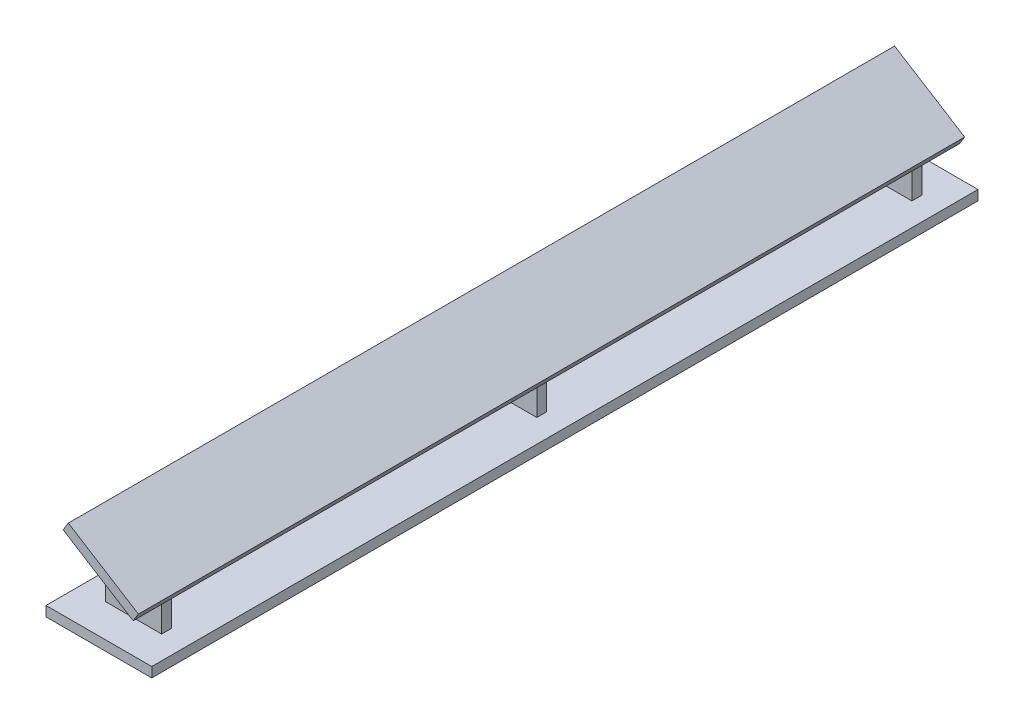
ISO-10303-21;
HEADER;
FILE_DESCRIPTION(('STEP AP214'),'2;1');
FILE_NAME('part.step','',(''),(''),'','','');
FILE_SCHEMA(('AUTOMOTIVE_DESIGN { 1 0 10303 214 1 1 1 1 }'));
ENDSEC;
DATA;
#1=APPLICATION_CONTEXT('core data for automotive mechanical design processes');
#2=APPLICATION_PROTOCOL_DEFINITION('international standard','automotive_design',2000,#1);
#3=PRODUCT_CONTEXT('',#1,'mechanical');
#4=PRODUCT('Part','Part','',(#3));
#5=PRODUCT_RELATED_PRODUCT_CATEGORY('part','',(#4));
#6=PRODUCT_DEFINITION_FORMATION('','',#4);
#7=PRODUCT_DEFINITION_CONTEXT('part definition',#1,'design');
#8=PRODUCT_DEFINITION('design','',#6,#7);
#9=PRODUCT_DEFINITION_SHAPE('','',#8);
#10=(LENGTH_UNIT() NAMED_UNIT(*) SI_UNIT(.MILLI.,.METRE.));
#11=(NAMED_UNIT(*) PLANE_ANGLE_UNIT() SI_UNIT($,.RADIAN.));
#12=(NAMED_UNIT(*) SI_UNIT($,.STERADIAN.) SOLID_ANGLE_UNIT());
#13=UNCERTAINTY_MEASURE_WITH_UNIT(LENGTH_MEASURE(1.E-05),#10,'distance_accuracy_value','');
#14=(GEOMETRIC_REPRESENTATION_CONTEXT(3) GLOBAL_UNCERTAINTY_ASSIGNED_CONTEXT((#13)) GLOBAL_UNIT_ASSIGNED_CONTEXT((#10,
#11,#12)) REPRESENTATION_CONTEXT('',''));
#15=CARTESIAN_POINT('',(0.,0.,0.));
#16=DIRECTION('',(0.,0.,1.));
#17=DIRECTION('',(1.,0.,0.));
#18=AXIS2_PLACEMENT_3D('',#15,#16,#17);
#19=CARTESIAN_POINT('',(940.,6.,500.));
#20=DIRECTION('',(1.,0.,0.));
#21=DIRECTION('',(0.,0.,-1.));
#22=AXIS2_PLACEMENT_3D('',#19,#20,#21);
#23=PLANE('',#22);
#24=DIRECTION('',(0.,-1.,0.));
#25=VECTOR('',#24,1.);
#26=CARTESIAN_POINT('',(940.,6.,0.));
#27=LINE('',#26,#25);
#28=CARTESIAN_POINT('',(940.,6.,0.));
#29=VERTEX_POINT('',#28);
#30=CARTESIAN_POINT('',(940.,0.,0.));
#31=VERTEX_POINT('',#30);
#32=EDGE_CURVE('E302',#29,#31,#27,.T.);
#33=ORIENTED_EDGE('',*,*,#32,.T.);
#34=DIRECTION('',(0.,0.,-1.));
#35=VECTOR('',#34,1.);
#36=CARTESIAN_POINT('',(940.,0.,500.));
#37=LINE('',#36,#35);
#38=CARTESIAN_POINT('',(940.,0.,500.));
#39=VERTEX_POINT('',#38);
#40=EDGE_CURVE('E11',#39,#31,#37,.T.);
#41=ORIENTED_EDGE('',*,*,#40,.F.);
#42=DIRECTION('',(0.,-1.,0.));
#43=VECTOR('',#42,1.);
#44=CARTESIAN_POINT('',(940.,6.,500.));
#45=LINE('',#44,#43);
#46=CARTESIAN_POINT('',(940.,6.,500.));
#47=VERTEX_POINT('',#46);
#48=EDGE_CURVE('E303',#47,#39,#45,.T.);
#49=ORIENTED_EDGE('',*,*,#48,.F.);
#50=DIRECTION('',(0.,0.,-1.));
#51=VECTOR('',#50,1.);
#52=CARTESIAN_POINT('',(940.,6.,500.));
#53=LINE('',#52,#51);
#54=EDGE_CURVE('E313',#47,#29,#53,.T.);
#55=ORIENTED_EDGE('',*,*,#54,.T.);
#56=EDGE_LOOP('',(#33,#41,#49,#55));
#57=FACE_BOUND('',#56,.T.);
#58=ADVANCED_FACE('F43',(#57),#23,.F.);
#59=CARTESIAN_POINT('',(940.,0.,500.));
#60=DIRECTION('',(0.,1.,0.));
#61=DIRECTION('',(0.,0.,1.));
#62=AXIS2_PLACEMENT_3D('',#59,#60,#61);
#63=PLANE('',#62);
#64=DIRECTION('',(1.,0.,0.));
#65=VECTOR('',#64,1.);
#66=CARTESIAN_POINT('',(940.,0.,0.));
#67=LINE('',#66,#65);
#68=CARTESIAN_POINT('',(1004.,0.,0.));
#69=VERTEX_POINT('',#68);
#70=EDGE_CURVE('E316',#31,#69,#67,.T.);
#71=ORIENTED_EDGE('',*,*,#70,.T.);
#72=DIRECTION('',(0.,0.,-1.));
#73=VECTOR('',#72,1.);
#74=CARTESIAN_POINT('',(1004.,0.,500.));
#75=LINE('',#74,#73);
#76=CARTESIAN_POINT('',(1004.,0.,500.));
#77=VERTEX_POINT('',#76);
#78=EDGE_CURVE('E50',#77,#69,#75,.T.);
#79=ORIENTED_EDGE('',*,*,#78,.F.);
#80=DIRECTION('',(1.,0.,0.));
#81=VECTOR('',#80,1.);
#82=CARTESIAN_POINT('',(940.,0.,500.));
#83=LINE('',#82,#81);
#84=EDGE_CURVE('E306',#39,#77,#83,.T.);
#85=ORIENTED_EDGE('',*,*,#84,.F.);
#86=ORIENTED_EDGE('',*,*,#40,.T.);
#87=EDGE_LOOP('',(#71,#79,#85,#86));
#88=FACE_BOUND('',#87,.T.);
#89=ADVANCED_FACE('F345',(#88),#63,.F.);
#90=CARTESIAN_POINT('',(1004.,0.,500.));
#91=DIRECTION('',(-1.,0.,0.));
#92=DIRECTION('',(0.,0.,1.));
#93=AXIS2_PLACEMENT_3D('',#90,#91,#92);
#94=PLANE('',#93);
#95=DIRECTION('',(0.,1.,0.));
#96=VECTOR('',#95,1.);
#97=CARTESIAN_POINT('',(1004.,0.,0.));
#98=LINE('',#97,#96);
#99=CARTESIAN_POINT('',(1004.,6.,0.));
#100=VERTEX_POINT('',#99);
#101=EDGE_CURVE('E318',#69,#100,#98,.T.);
#102=ORIENTED_EDGE('',*,*,#101,.T.);
#103=DIRECTION('',(0.,0.,-1.));
#104=VECTOR('',#103,1.);
#105=CARTESIAN_POINT('',(1004.,6.,500.));
#106=LINE('',#105,#104);
#107=CARTESIAN_POINT('',(1004.,6.,500.));
#108=VERTEX_POINT('',#107);
#109=EDGE_CURVE('E323',#108,#100,#106,.T.);
#110=ORIENTED_EDGE('',*,*,#109,.F.);
#111=DIRECTION('',(0.,1.,0.));
#112=VECTOR('',#111,1.);
#113=CARTESIAN_POINT('',(1004.,0.,500.));
#114=LINE('',#113,#112);
#115=EDGE_CURVE('E309',#77,#108,#114,.T.);
#116=ORIENTED_EDGE('',*,*,#115,.F.);
#117=ORIENTED_EDGE('',*,*,#78,.T.);
#118=EDGE_LOOP('',(#102,#110,#116,#117));
#119=FACE_BOUND('',#118,.T.);
#120=ADVANCED_FACE('F330',(#119),#94,.F.);
#121=CARTESIAN_POINT('',(1004.,6.,500.));
#122=DIRECTION('',(0.,-1.,0.));
#123=DIRECTION('',(0.,0.,-1.));
#124=AXIS2_PLACEMENT_3D('',#121,#122,#123);
#125=PLANE('',#124);
#126=DIRECTION('',(0.,0.,-1.));
#127=VECTOR('',#126,1.);
#128=CARTESIAN_POINT('',(990.,6.,480.));
#129=LINE('',#128,#127);
#130=CARTESIAN_POINT('',(990.,6.,480.));
#131=VERTEX_POINT('',#130);
#132=CARTESIAN_POINT('',(990.,6.,474.));
#133=VERTEX_POINT('',#132);
#134=EDGE_CURVE('E62',#131,#133,#129,.T.);
#135=ORIENTED_EDGE('',*,*,#134,.F.);
#136=DIRECTION('',(1.,0.,0.));
#137=VECTOR('',#136,1.);
#138=CARTESIAN_POINT('',(956.,6.,480.));
#139=LINE('',#138,#137);
#140=CARTESIAN_POINT('',(956.,6.,480.));
#141=VERTEX_POINT('',#140);
#142=EDGE_CURVE('E57',#141,#131,#139,.T.);
#143=ORIENTED_EDGE('',*,*,#142,.F.);
#144=DIRECTION('',(0.,0.,-1.));
#145=VECTOR('',#144,1.);
#146=CARTESIAN_POINT('',(956.,6.,480.));
#147=LINE('',#146,#145);
#148=CARTESIAN_POINT('',(956.,6.,474.));
#149=VERTEX_POINT('',#148);
#150=EDGE_CURVE('E175',#141,#149,#147,.T.);
#151=ORIENTED_EDGE('',*,*,#150,.T.);
#152=DIRECTION('',(1.,0.,0.));
#153=VECTOR('',#152,1.);
#154=CARTESIAN_POINT('',(956.,6.,474.));
#155=LINE('',#154,#153);
#156=EDGE_CURVE('E179',#149,#133,#155,.T.);
#157=ORIENTED_EDGE('',*,*,#156,.T.);
#158=EDGE_LOOP('',(#135,#143,#151,#157));
#159=FACE_BOUND('',#158,.T.);
#160=DIRECTION('',(0.,0.,-1.));
#161=VECTOR('',#160,1.);
#162=CARTESIAN_POINT('',(990.,6.,253.));
#163=LINE('',#162,#161);
#164=CARTESIAN_POINT('',(990.,6.,253.));
#165=VERTEX_POINT('',#164);
#166=CARTESIAN_POINT('',(990.,6.,247.));
#167=VERTEX_POINT('',#166);
#168=EDGE_CURVE('E236',#165,#167,#163,.T.);
#169=ORIENTED_EDGE('',*,*,#168,.F.);
#170=DIRECTION('',(1.,0.,0.));
#171=VECTOR('',#170,1.);
#172=CARTESIAN_POINT('',(956.,6.,253.));
#173=LINE('',#172,#171);
#174=CARTESIAN_POINT('',(956.,6.,253.));
#175=VERTEX_POINT('',#174);
#176=EDGE_CURVE('E213',#175,#165,#173,.T.);
#177=ORIENTED_EDGE('',*,*,#176,.F.);
#178=DIRECTION('',(0.,0.,-1.));
#179=VECTOR('',#178,1.);
#180=CARTESIAN_POINT('',(956.,6.,253.));
#181=LINE('',#180,#179);
#182=CARTESIAN_POINT('',(956.,6.,247.));
#183=VERTEX_POINT('',#182);
#184=EDGE_CURVE('E239',#175,#183,#181,.T.);
#185=ORIENTED_EDGE('',*,*,#184,.T.);
#186=DIRECTION('',(1.,0.,0.));
#187=VECTOR('',#186,1.);
#188=CARTESIAN_POINT('',(956.,6.,247.));
#189=LINE('',#188,#187);
#190=EDGE_CURVE('E226',#183,#167,#189,.T.);
#191=ORIENTED_EDGE('',*,*,#190,.T.);
#192=EDGE_LOOP('',(#169,#177,#185,#191));
#193=FACE_BOUND('',#192,.T.);
#194=DIRECTION('',(0.,0.,-1.));
#195=VECTOR('',#194,1.);
#196=CARTESIAN_POINT('',(990.,6.,26.));
#197=LINE('',#196,#195);
#198=CARTESIAN_POINT('',(990.,6.,26.));
#199=VERTEX_POINT('',#198);
#200=CARTESIAN_POINT('',(990.,6.,20.));
#201=VERTEX_POINT('',#200);
#202=EDGE_CURVE('E297',#199,#201,#197,.T.);
#203=ORIENTED_EDGE('',*,*,#202,.F.);
#204=DIRECTION('',(1.,0.,0.));
#205=VECTOR('',#204,1.);
#206=CARTESIAN_POINT('',(956.,6.,26.));
#207=LINE('',#206,#205);
#208=CARTESIAN_POINT('',(956.,6.,26.));
#209=VERTEX_POINT('',#208);
#210=EDGE_CURVE('E275',#209,#199,#207,.T.);
#211=ORIENTED_EDGE('',*,*,#210,.F.);
#212=DIRECTION('',(0.,0.,-1.));
#213=VECTOR('',#212,1.);
#214=CARTESIAN_POINT('',(956.,6.,26.));
#215=LINE('',#214,#213);
#216=CARTESIAN_POINT('',(956.,6.,20.));
#217=VERTEX_POINT('',#216);
#218=EDGE_CURVE('E300',#209,#217,#215,.T.);
#219=ORIENTED_EDGE('',*,*,#218,.T.);
#220=DIRECTION('',(1.,0.,0.));
#221=VECTOR('',#220,1.);
#222=CARTESIAN_POINT('',(956.,6.,20.));
#223=LINE('',#222,#221);
#224=EDGE_CURVE('E286',#217,#201,#223,.T.);
#225=ORIENTED_EDGE('',*,*,#224,.T.);
#226=EDGE_LOOP('',(#203,#211,#219,#225));
#227=FACE_BOUND('',#226,.T.);
#228=DIRECTION('',(-1.,0.,0.));
#229=VECTOR('',#228,1.);
#230=CARTESIAN_POINT('',(1004.,6.,0.));
#231=LINE('',#230,#229);
#232=EDGE_CURVE('E307',#100,#29,#231,.T.);
#233=ORIENTED_EDGE('',*,*,#232,.T.);
#234=ORIENTED_EDGE('',*,*,#54,.F.);
#235=DIRECTION('',(-1.,0.,0.));
#236=VECTOR('',#235,1.);
#237=CARTESIAN_POINT('',(1004.,6.,500.));
#238=LINE('',#237,#236);
#239=EDGE_CURVE('E311',#108,#47,#238,.T.);
#240=ORIENTED_EDGE('',*,*,#239,.F.);
#241=ORIENTED_EDGE('',*,*,#109,.T.);
#242=EDGE_LOOP('',(#233,#234,#240,#241));
#243=FACE_BOUND('',#242,.T.);
#244=ADVANCED_FACE('F177',(#159,#193,#227,#243),#125,.F.);
#245=CARTESIAN_POINT('',(0.,0.,500.));
#246=DIRECTION('',(0.,0.,1.));
#247=DIRECTION('',(1.,0.,0.));
#248=AXIS2_PLACEMENT_3D('',#245,#246,#247);
#249=PLANE('',#248);
#250=ORIENTED_EDGE('',*,*,#48,.T.);
#251=ORIENTED_EDGE('',*,*,#84,.T.);
#252=ORIENTED_EDGE('',*,*,#115,.T.);
#253=ORIENTED_EDGE('',*,*,#239,.T.);
#254=EDGE_LOOP('',(#250,#251,#252,#253));
#255=FACE_BOUND('',#254,.T.);
#256=ADVANCED_FACE('F344',(#255),#249,.T.);
#257=CARTESIAN_POINT('',(0.,0.,0.));
#258=DIRECTION('',(0.,0.,1.));
#259=DIRECTION('',(1.,0.,0.));
#260=AXIS2_PLACEMENT_3D('',#257,#258,#259);
#261=PLANE('',#260);
#262=ORIENTED_EDGE('',*,*,#32,.F.);
#263=ORIENTED_EDGE('',*,*,#232,.F.);
#264=ORIENTED_EDGE('',*,*,#101,.F.);
#265=ORIENTED_EDGE('',*,*,#70,.F.);
#266=EDGE_LOOP('',(#262,#263,#264,#265));
#267=FACE_BOUND('',#266,.T.);
#268=ADVANCED_FACE('F336',(#267),#261,.F.);
#269=CARTESIAN_POINT('',(956.,47.3156464261822,26.));
#270=DIRECTION('',(1.,0.,0.));
#271=DIRECTION('',(0.,0.,-1.));
#272=AXIS2_PLACEMENT_3D('',#269,#270,#271);
#273=PLANE('',#272);
#274=DIRECTION('',(0.,-1.,0.));
#275=VECTOR('',#274,1.);
#276=CARTESIAN_POINT('',(956.,47.3156464261822,20.));
#277=LINE('',#276,#275);
#278=CARTESIAN_POINT('',(956.,47.3156464261821,20.));
#279=VERTEX_POINT('',#278);
#280=EDGE_CURVE('E271',#279,#217,#277,.T.);
#281=ORIENTED_EDGE('',*,*,#280,.T.);
#282=ORIENTED_EDGE('',*,*,#218,.F.);
#283=DIRECTION('',(0.,-1.,0.));
#284=VECTOR('',#283,1.);
#285=CARTESIAN_POINT('',(956.,47.3156464261822,26.));
#286=LINE('',#285,#284);
#287=CARTESIAN_POINT('',(956.,47.3156464261822,26.));
#288=VERTEX_POINT('',#287);
#289=EDGE_CURVE('E272',#288,#209,#286,.T.);
#290=ORIENTED_EDGE('',*,*,#289,.F.);
#291=DIRECTION('',(0.,0.,-1.));
#292=VECTOR('',#291,1.);
#293=CARTESIAN_POINT('',(956.,47.3156464261822,26.));
#294=LINE('',#293,#292);
#295=EDGE_CURVE('E283',#288,#279,#294,.T.);
#296=ORIENTED_EDGE('',*,*,#295,.T.);
#297=EDGE_LOOP('',(#281,#282,#290,#296));
#298=FACE_BOUND('',#297,.T.);
#299=ADVANCED_FACE('F357',(#298),#273,.F.);
#300=CARTESIAN_POINT('',(990.,6.,26.));
#301=DIRECTION('',(-1.,0.,0.));
#302=DIRECTION('',(0.,0.,1.));
#303=AXIS2_PLACEMENT_3D('',#300,#301,#302);
#304=PLANE('',#303);
#305=DIRECTION('',(0.,1.,0.));
#306=VECTOR('',#305,1.);
#307=CARTESIAN_POINT('',(990.,6.,20.));
#308=LINE('',#307,#306);
#309=CARTESIAN_POINT('',(990.,26.0700884612651,20.));
#310=VERTEX_POINT('',#309);
#311=EDGE_CURVE('E288',#201,#310,#308,.T.);
#312=ORIENTED_EDGE('',*,*,#311,.T.);
#313=DIRECTION('',(0.,0.,-1.));
#314=VECTOR('',#313,1.);
#315=CARTESIAN_POINT('',(990.,26.0700884612651,26.));
#316=LINE('',#315,#314);
#317=CARTESIAN_POINT('',(990.,26.0700884612651,26.));
#318=VERTEX_POINT('',#317);
#319=EDGE_CURVE('E294',#318,#310,#316,.T.);
#320=ORIENTED_EDGE('',*,*,#319,.F.);
#321=DIRECTION('',(0.,1.,0.));
#322=VECTOR('',#321,1.);
#323=CARTESIAN_POINT('',(990.,6.,26.));
#324=LINE('',#323,#322);
#325=EDGE_CURVE('E279',#199,#318,#324,.T.);
#326=ORIENTED_EDGE('',*,*,#325,.F.);
#327=ORIENTED_EDGE('',*,*,#202,.T.);
#328=EDGE_LOOP('',(#312,#320,#326,#327));
#329=FACE_BOUND('',#328,.T.);
#330=ADVANCED_FACE('F362',(#329),#304,.F.);
#331=CARTESIAN_POINT('',(0.,0.,26.));
#332=DIRECTION('',(0.,0.,1.));
#333=DIRECTION('',(1.,0.,0.));
#334=AXIS2_PLACEMENT_3D('',#331,#332,#333);
#335=PLANE('',#334);
#336=ORIENTED_EDGE('',*,*,#289,.T.);
#337=ORIENTED_EDGE('',*,*,#210,.T.);
#338=ORIENTED_EDGE('',*,*,#325,.T.);
#339=DIRECTION('',(-0.848048096156427,0.529919264233204,0.));
#340=VECTOR('',#339,1.);
#341=CARTESIAN_POINT('',(990.,26.0700884612651,26.));
#342=LINE('',#341,#340);
#343=EDGE_CURVE('E281',#318,#288,#342,.T.);
#344=ORIENTED_EDGE('',*,*,#343,.T.);
#345=EDGE_LOOP('',(#336,#337,#338,#344));
#346=FACE_BOUND('',#345,.T.);
#347=ADVANCED_FACE('F366',(#346),#335,.T.);
#348=CARTESIAN_POINT('',(0.,0.,20.));
#349=DIRECTION('',(0.,0.,1.));
#350=DIRECTION('',(1.,0.,0.));
#351=AXIS2_PLACEMENT_3D('',#348,#349,#350);
#352=PLANE('',#351);
#353=ORIENTED_EDGE('',*,*,#280,.F.);
#354=DIRECTION('',(-0.848048096156427,0.529919264233204,0.));
#355=VECTOR('',#354,1.);
#356=CARTESIAN_POINT('',(990.,26.0700884612651,20.));
#357=LINE('',#356,#355);
#358=EDGE_CURVE('E276',#310,#279,#357,.T.);
#359=ORIENTED_EDGE('',*,*,#358,.F.);
#360=ORIENTED_EDGE('',*,*,#311,.F.);
#361=ORIENTED_EDGE('',*,*,#224,.F.);
#362=EDGE_LOOP('',(#353,#359,#360,#361));
#363=FACE_BOUND('',#362,.T.);
#364=ADVANCED_FACE('F368',(#363),#352,.F.);
#365=CARTESIAN_POINT('',(950.346498706273,50.8483461156122,500.));
#366=DIRECTION('',(0.84804809615642,-0.529919264233214,0.));
#367=DIRECTION('',(0.529919264233214,0.84804809615642,0.));
#368=AXIS2_PLACEMENT_3D('',#365,#366,#367);
#369=PLANE('',#368);
#370=DIRECTION('',(-0.529919264233214,-0.84804809615642,0.));
#371=VECTOR('',#370,1.);
#372=CARTESIAN_POINT('',(950.346498706273,50.8483461156122,0.));
#373=LINE('',#372,#371);
#374=CARTESIAN_POINT('',(953.526014291672,55.9366346925507,0.));
#375=VERTEX_POINT('',#374);
#376=CARTESIAN_POINT('',(950.346498706273,50.8483461156122,0.));
#377=VERTEX_POINT('',#376);
#378=EDGE_CURVE('E241',#375,#377,#373,.T.);
#379=ORIENTED_EDGE('',*,*,#378,.T.);
#380=DIRECTION('',(0.,0.,-1.));
#381=VECTOR('',#380,1.);
#382=CARTESIAN_POINT('',(950.346498706273,50.8483461156122,500.));
#383=LINE('',#382,#381);
#384=CARTESIAN_POINT('',(950.346498706273,50.8483461156122,500.));
#385=VERTEX_POINT('',#384);
#386=EDGE_CURVE('E268',#385,#377,#383,.T.);
#387=ORIENTED_EDGE('',*,*,#386,.F.);
#388=DIRECTION('',(-0.529919264233214,-0.84804809615642,0.));
#389=VECTOR('',#388,1.);
#390=CARTESIAN_POINT('',(950.346498706273,50.8483461156122,500.));
#391=LINE('',#390,#389);
#392=CARTESIAN_POINT('',(953.526014291672,55.9366346925507,500.));
#393=VERTEX_POINT('',#392);
#394=EDGE_CURVE('E242',#393,#385,#391,.T.);
#395=ORIENTED_EDGE('',*,*,#394,.F.);
#396=DIRECTION('',(0.,0.,-1.));
#397=VECTOR('',#396,1.);
#398=CARTESIAN_POINT('',(953.526014291672,55.9366346925507,500.));
#399=LINE('',#398,#397);
#400=EDGE_CURVE('E252',#393,#375,#399,.T.);
#401=ORIENTED_EDGE('',*,*,#400,.T.);
#402=EDGE_LOOP('',(#379,#387,#395,#401));
#403=FACE_BOUND('',#402,.T.);
#404=ADVANCED_FACE('F371',(#403),#369,.F.);
#405=CARTESIAN_POINT('',(992.748903514094,24.3523829039519,500.));
#406=DIRECTION('',(0.529919264233206,0.848048096156426,0.));
#407=DIRECTION('',(-0.848048096156425,0.529919264233206,0.));
#408=AXIS2_PLACEMENT_3D('',#405,#406,#407);
#409=PLANE('',#408);
#410=DIRECTION('',(0.,0.,-1.));
#411=VECTOR('',#410,1.);
#412=CARTESIAN_POINT('',(956.,47.3156464261822,480.));
#413=LINE('',#412,#411);
#414=CARTESIAN_POINT('',(956.,47.3156464261822,480.));
#415=VERTEX_POINT('',#414);
#416=CARTESIAN_POINT('',(956.,47.3156464261822,474.));
#417=VERTEX_POINT('',#416);
#418=EDGE_CURVE('E196',#415,#417,#413,.T.);
#419=ORIENTED_EDGE('',*,*,#418,.F.);
#420=DIRECTION('',(-0.848048096156427,0.529919264233204,0.));
#421=VECTOR('',#420,1.);
#422=CARTESIAN_POINT('',(990.,26.0700884612651,480.));
#423=LINE('',#422,#421);
#424=CARTESIAN_POINT('',(990.,26.070088461265,480.));
#425=VERTEX_POINT('',#424);
#426=EDGE_CURVE('E199',#425,#415,#423,.T.);
#427=ORIENTED_EDGE('',*,*,#426,.F.);
#428=DIRECTION('',(0.,0.,-1.));
#429=VECTOR('',#428,1.);
#430=CARTESIAN_POINT('',(990.,26.0700884612651,480.));
#431=LINE('',#430,#429);
#432=CARTESIAN_POINT('',(990.,26.0700884612651,474.));
#433=VERTEX_POINT('',#432);
#434=EDGE_CURVE('E207',#425,#433,#431,.T.);
#435=ORIENTED_EDGE('',*,*,#434,.T.);
#436=DIRECTION('',(-0.848048096156427,0.529919264233204,0.));
#437=VECTOR('',#436,1.);
#438=CARTESIAN_POINT('',(990.,26.0700884612651,474.));
#439=LINE('',#438,#437);
#440=EDGE_CURVE('E203',#433,#417,#439,.T.);
#441=ORIENTED_EDGE('',*,*,#440,.T.);
#442=EDGE_LOOP('',(#419,#427,#435,#441));
#443=FACE_BOUND('',#442,.T.);
#444=DIRECTION('',(0.,0.,-1.));
#445=VECTOR('',#444,1.);
#446=CARTESIAN_POINT('',(956.,47.3156464261822,253.));
#447=LINE('',#446,#445);
#448=CARTESIAN_POINT('',(956.,47.3156464261822,253.));
#449=VERTEX_POINT('',#448);
#450=CARTESIAN_POINT('',(956.,47.3156464261822,247.));
#451=VERTEX_POINT('',#450);
#452=EDGE_CURVE('E223',#449,#451,#447,.T.);
#453=ORIENTED_EDGE('',*,*,#452,.F.);
#454=DIRECTION('',(-0.848048096156427,0.529919264233204,0.));
#455=VECTOR('',#454,1.);
#456=CARTESIAN_POINT('',(990.,26.0700884612651,253.));
#457=LINE('',#456,#455);
#458=CARTESIAN_POINT('',(990.,26.070088461265,253.));
#459=VERTEX_POINT('',#458);
#460=EDGE_CURVE('E220',#459,#449,#457,.T.);
#461=ORIENTED_EDGE('',*,*,#460,.F.);
#462=DIRECTION('',(0.,0.,-1.));
#463=VECTOR('',#462,1.);
#464=CARTESIAN_POINT('',(990.,26.0700884612651,253.));
#465=LINE('',#464,#463);
#466=CARTESIAN_POINT('',(990.,26.0700884612651,247.));
#467=VERTEX_POINT('',#466);
#468=EDGE_CURVE('E234',#459,#467,#465,.T.);
#469=ORIENTED_EDGE('',*,*,#468,.T.);
#470=DIRECTION('',(-0.848048096156427,0.529919264233204,0.));
#471=VECTOR('',#470,1.);
#472=CARTESIAN_POINT('',(990.,26.0700884612651,247.));
#473=LINE('',#472,#471);
#474=EDGE_CURVE('E214',#467,#451,#473,.T.);
#475=ORIENTED_EDGE('',*,*,#474,.T.);
#476=EDGE_LOOP('',(#453,#461,#469,#475));
#477=FACE_BOUND('',#476,.T.);
#478=ORIENTED_EDGE('',*,*,#343,.F.);
#479=ORIENTED_EDGE('',*,*,#319,.T.);
#480=ORIENTED_EDGE('',*,*,#358,.T.);
#481=ORIENTED_EDGE('',*,*,#295,.F.);
#482=EDGE_LOOP('',(#478,#479,#480,#481));
#483=FACE_BOUND('',#482,.T.);
#484=DIRECTION('',(0.848048096156425,-0.529919264233206,0.));
#485=VECTOR('',#484,1.);
#486=CARTESIAN_POINT('',(992.748903514094,24.3523829039519,0.));
#487=LINE('',#486,#485);
#488=CARTESIAN_POINT('',(992.748903514094,24.3523829039519,0.));
#489=VERTEX_POINT('',#488);
#490=EDGE_CURVE('E255',#377,#489,#487,.T.);
#491=ORIENTED_EDGE('',*,*,#490,.T.);
#492=DIRECTION('',(0.,0.,-1.));
#493=VECTOR('',#492,1.);
#494=CARTESIAN_POINT('',(992.748903514094,24.3523829039519,500.));
#495=LINE('',#494,#493);
#496=CARTESIAN_POINT('',(992.748903514094,24.3523829039519,500.));
#497=VERTEX_POINT('',#496);
#498=EDGE_CURVE('E265',#497,#489,#495,.T.);
#499=ORIENTED_EDGE('',*,*,#498,.F.);
#500=DIRECTION('',(0.848048096156425,-0.529919264233206,0.));
#501=VECTOR('',#500,1.);
#502=CARTESIAN_POINT('',(992.748903514094,24.3523829039519,500.));
#503=LINE('',#502,#501);
#504=EDGE_CURVE('E245',#385,#497,#503,.T.);
#505=ORIENTED_EDGE('',*,*,#504,.F.);
#506=ORIENTED_EDGE('',*,*,#386,.T.);
#507=EDGE_LOOP('',(#491,#499,#505,#506));
#508=FACE_BOUND('',#507,.T.);
#509=ADVANCED_FACE('F378',(#443,#477,#483,#508),#409,.F.);
#510=CARTESIAN_POINT('',(995.928419099493,29.4406714808905,500.));
#511=DIRECTION('',(-0.84804809615642,0.529919264233214,0.));
#512=DIRECTION('',(-0.529919264233214,-0.84804809615642,0.));
#513=AXIS2_PLACEMENT_3D('',#510,#511,#512);
#514=PLANE('',#513);
#515=DIRECTION('',(0.529919264233214,0.84804809615642,0.));
#516=VECTOR('',#515,1.);
#517=CARTESIAN_POINT('',(995.928419099493,29.4406714808905,0.));
#518=LINE('',#517,#516);
#519=CARTESIAN_POINT('',(995.928419099493,29.4406714808905,0.));
#520=VERTEX_POINT('',#519);
#521=EDGE_CURVE('E257',#489,#520,#518,.T.);
#522=ORIENTED_EDGE('',*,*,#521,.T.);
#523=DIRECTION('',(0.,0.,-1.));
#524=VECTOR('',#523,1.);
#525=CARTESIAN_POINT('',(995.928419099493,29.4406714808905,500.));
#526=LINE('',#525,#524);
#527=CARTESIAN_POINT('',(995.928419099493,29.4406714808905,500.));
#528=VERTEX_POINT('',#527);
#529=EDGE_CURVE('E262',#528,#520,#526,.T.);
#530=ORIENTED_EDGE('',*,*,#529,.F.);
#531=DIRECTION('',(0.529919264233214,0.84804809615642,0.));
#532=VECTOR('',#531,1.);
#533=CARTESIAN_POINT('',(995.928419099493,29.4406714808905,500.));
#534=LINE('',#533,#532);
#535=EDGE_CURVE('E248',#497,#528,#534,.T.);
#536=ORIENTED_EDGE('',*,*,#535,.F.);
#537=ORIENTED_EDGE('',*,*,#498,.T.);
#538=EDGE_LOOP('',(#522,#530,#536,#537));
#539=FACE_BOUND('',#538,.T.);
#540=ADVANCED_FACE('F382',(#539),#514,.F.);
#541=CARTESIAN_POINT('',(953.526014291672,55.9366346925507,500.));
#542=DIRECTION('',(-0.529919264233206,-0.848048096156426,0.));
#543=DIRECTION('',(0.848048096156425,-0.529919264233206,0.));
#544=AXIS2_PLACEMENT_3D('',#541,#542,#543);
#545=PLANE('',#544);
#546=DIRECTION('',(-0.848048096156425,0.529919264233206,0.));
#547=VECTOR('',#546,1.);
#548=CARTESIAN_POINT('',(953.526014291672,55.9366346925507,0.));
#549=LINE('',#548,#547);
#550=EDGE_CURVE('E246',#520,#375,#549,.T.);
#551=ORIENTED_EDGE('',*,*,#550,.T.);
#552=ORIENTED_EDGE('',*,*,#400,.F.);
#553=DIRECTION('',(-0.848048096156425,0.529919264233206,0.));
#554=VECTOR('',#553,1.);
#555=CARTESIAN_POINT('',(953.526014291672,55.9366346925507,500.));
#556=LINE('',#555,#554);
#557=EDGE_CURVE('E250',#528,#393,#556,.T.);
#558=ORIENTED_EDGE('',*,*,#557,.F.);
#559=ORIENTED_EDGE('',*,*,#529,.T.);
#560=EDGE_LOOP('',(#551,#552,#558,#559));
#561=FACE_BOUND('',#560,.T.);
#562=ADVANCED_FACE('F386',(#561),#545,.F.);
#563=CARTESIAN_POINT('',(0.,0.,500.));
#564=DIRECTION('',(0.,0.,-1.));
#565=DIRECTION('',(-1.,0.,0.));
#566=AXIS2_PLACEMENT_3D('',#563,#564,#565);
#567=PLANE('',#566);
#568=ORIENTED_EDGE('',*,*,#394,.T.);
#569=ORIENTED_EDGE('',*,*,#504,.T.);
#570=ORIENTED_EDGE('',*,*,#535,.T.);
#571=ORIENTED_EDGE('',*,*,#557,.T.);
#572=EDGE_LOOP('',(#568,#569,#570,#571));
#573=FACE_BOUND('',#572,.T.);
#574=ADVANCED_FACE('F390',(#573),#567,.F.);
#575=CARTESIAN_POINT('',(0.,0.,0.));
#576=DIRECTION('',(0.,0.,-1.));
#577=DIRECTION('',(-1.,0.,0.));
#578=AXIS2_PLACEMENT_3D('',#575,#576,#577);
#579=PLANE('',#578);
#580=ORIENTED_EDGE('',*,*,#378,.F.);
#581=ORIENTED_EDGE('',*,*,#550,.F.);
#582=ORIENTED_EDGE('',*,*,#521,.F.);
#583=ORIENTED_EDGE('',*,*,#490,.F.);
#584=EDGE_LOOP('',(#580,#581,#582,#583));
#585=FACE_BOUND('',#584,.T.);
#586=ADVANCED_FACE('F392',(#585),#579,.T.);
#587=CARTESIAN_POINT('',(956.,47.3156464261822,253.));
#588=DIRECTION('',(1.,0.,0.));
#589=DIRECTION('',(0.,0.,-1.));
#590=AXIS2_PLACEMENT_3D('',#587,#588,#589);
#591=PLANE('',#590);
#592=DIRECTION('',(0.,-1.,0.));
#593=VECTOR('',#592,1.);
#594=CARTESIAN_POINT('',(956.,47.3156464261822,247.));
#595=LINE('',#594,#593);
#596=EDGE_CURVE('E183',#451,#183,#595,.T.);
#597=ORIENTED_EDGE('',*,*,#596,.T.);
#598=ORIENTED_EDGE('',*,*,#184,.F.);
#599=DIRECTION('',(0.,-1.,0.));
#600=VECTOR('',#599,1.);
#601=CARTESIAN_POINT('',(956.,47.3156464261822,253.));
#602=LINE('',#601,#600);
#603=EDGE_CURVE('E210',#449,#175,#602,.T.);
#604=ORIENTED_EDGE('',*,*,#603,.F.);
#605=ORIENTED_EDGE('',*,*,#452,.T.);
#606=EDGE_LOOP('',(#597,#598,#604,#605));
#607=FACE_BOUND('',#606,.T.);
#608=ADVANCED_FACE('F395',(#607),#591,.F.);
#609=CARTESIAN_POINT('',(990.,6.,253.));
#610=DIRECTION('',(-1.,0.,0.));
#611=DIRECTION('',(0.,0.,1.));
#612=AXIS2_PLACEMENT_3D('',#609,#610,#611);
#613=PLANE('',#612);
#614=DIRECTION('',(0.,1.,0.));
#615=VECTOR('',#614,1.);
#616=CARTESIAN_POINT('',(990.,6.,247.));
#617=LINE('',#616,#615);
#618=EDGE_CURVE('E228',#167,#467,#617,.T.);
#619=ORIENTED_EDGE('',*,*,#618,.T.);
#620=ORIENTED_EDGE('',*,*,#468,.F.);
#621=DIRECTION('',(0.,1.,0.));
#622=VECTOR('',#621,1.);
#623=CARTESIAN_POINT('',(990.,6.,253.));
#624=LINE('',#623,#622);
#625=EDGE_CURVE('E217',#165,#459,#624,.T.);
#626=ORIENTED_EDGE('',*,*,#625,.F.);
#627=ORIENTED_EDGE('',*,*,#168,.T.);
#628=EDGE_LOOP('',(#619,#620,#626,#627));
#629=FACE_BOUND('',#628,.T.);
#630=ADVANCED_FACE('F402',(#629),#613,.F.);
#631=CARTESIAN_POINT('',(0.,0.,253.));
#632=DIRECTION('',(0.,0.,1.));
#633=DIRECTION('',(1.,0.,0.));
#634=AXIS2_PLACEMENT_3D('',#631,#632,#633);
#635=PLANE('',#634);
#636=ORIENTED_EDGE('',*,*,#603,.T.);
#637=ORIENTED_EDGE('',*,*,#176,.T.);
#638=ORIENTED_EDGE('',*,*,#625,.T.);
#639=ORIENTED_EDGE('',*,*,#460,.T.);
#640=EDGE_LOOP('',(#636,#637,#638,#639));
#641=FACE_BOUND('',#640,.T.);
#642=ADVANCED_FACE('F406',(#641),#635,.T.);
#643=CARTESIAN_POINT('',(0.,0.,247.));
#644=DIRECTION('',(0.,0.,1.));
#645=DIRECTION('',(1.,0.,0.));
#646=AXIS2_PLACEMENT_3D('',#643,#644,#645);
#647=PLANE('',#646);
#648=ORIENTED_EDGE('',*,*,#596,.F.);
#649=ORIENTED_EDGE('',*,*,#474,.F.);
#650=ORIENTED_EDGE('',*,*,#618,.F.);
#651=ORIENTED_EDGE('',*,*,#190,.F.);
#652=EDGE_LOOP('',(#648,#649,#650,#651));
#653=FACE_BOUND('',#652,.T.);
#654=ADVANCED_FACE('F408',(#653),#647,.F.);
#655=CARTESIAN_POINT('',(956.,47.3156464261822,480.));
#656=DIRECTION('',(1.,0.,0.));
#657=DIRECTION('',(0.,0.,-1.));
#658=AXIS2_PLACEMENT_3D('',#655,#656,#657);
#659=PLANE('',#658);
#660=DIRECTION('',(0.,-1.,0.));
#661=VECTOR('',#660,1.);
#662=CARTESIAN_POINT('',(956.,47.3156464261822,474.));
#663=LINE('',#662,#661);
#664=EDGE_CURVE('E190',#417,#149,#663,.T.);
#665=ORIENTED_EDGE('',*,*,#664,.T.);
#666=ORIENTED_EDGE('',*,*,#150,.F.);
#667=DIRECTION('',(0.,-1.,0.));
#668=VECTOR('',#667,1.);
#669=CARTESIAN_POINT('',(956.,47.3156464261822,480.));
#670=LINE('',#669,#668);
#671=EDGE_CURVE('E205',#415,#141,#670,.T.);
#672=ORIENTED_EDGE('',*,*,#671,.F.);
#673=ORIENTED_EDGE('',*,*,#418,.T.);
#674=EDGE_LOOP('',(#665,#666,#672,#673));
#675=FACE_BOUND('',#674,.T.);
#676=ADVANCED_FACE('F195',(#675),#659,.F.);
#677=CARTESIAN_POINT('',(990.,6.,480.));
#678=DIRECTION('',(-1.,0.,0.));
#679=DIRECTION('',(0.,0.,1.));
#680=AXIS2_PLACEMENT_3D('',#677,#678,#679);
#681=PLANE('',#680);
#682=DIRECTION('',(0.,1.,0.));
#683=VECTOR('',#682,1.);
#684=CARTESIAN_POINT('',(990.,6.,474.));
#685=LINE('',#684,#683);
#686=EDGE_CURVE('E192',#133,#433,#685,.T.);
#687=ORIENTED_EDGE('',*,*,#686,.T.);
#688=ORIENTED_EDGE('',*,*,#434,.F.);
#689=DIRECTION('',(0.,1.,0.));
#690=VECTOR('',#689,1.);
#691=CARTESIAN_POINT('',(990.,6.,480.));
#692=LINE('',#691,#690);
#693=EDGE_CURVE('E432',#131,#425,#692,.T.);
#694=ORIENTED_EDGE('',*,*,#693,.F.);
#695=ORIENTED_EDGE('',*,*,#134,.T.);
#696=EDGE_LOOP('',(#687,#688,#694,#695));
#697=FACE_BOUND('',#696,.T.);
#698=ADVANCED_FACE('F417',(#697),#681,.F.);
#699=CARTESIAN_POINT('',(0.,0.,480.));
#700=DIRECTION('',(0.,0.,1.));
#701=DIRECTION('',(1.,0.,0.));
#702=AXIS2_PLACEMENT_3D('',#699,#700,#701);
#703=PLANE('',#702);
#704=ORIENTED_EDGE('',*,*,#671,.T.);
#705=ORIENTED_EDGE('',*,*,#142,.T.);
#706=ORIENTED_EDGE('',*,*,#693,.T.);
#707=ORIENTED_EDGE('',*,*,#426,.T.);
#708=EDGE_LOOP('',(#704,#705,#706,#707));
#709=FACE_BOUND('',#708,.T.);
#710=ADVANCED_FACE('F420',(#709),#703,.T.);
#711=CARTESIAN_POINT('',(0.,0.,474.));
#712=DIRECTION('',(0.,0.,1.));
#713=DIRECTION('',(1.,0.,0.));
#714=AXIS2_PLACEMENT_3D('',#711,#712,#713);
#715=PLANE('',#714);
#716=ORIENTED_EDGE('',*,*,#664,.F.);
#717=ORIENTED_EDGE('',*,*,#440,.F.);
#718=ORIENTED_EDGE('',*,*,#686,.F.);
#719=ORIENTED_EDGE('',*,*,#156,.F.);
#720=EDGE_LOOP('',(#716,#717,#718,#719));
#721=FACE_BOUND('',#720,.T.);
#722=ADVANCED_FACE('F188',(#721),#715,.F.);
#723=CLOSED_SHELL('',(#58,#89,#120,#244,#256,#268,#299,#330,#347,#364,#404,#509,#540,#562,#574,
#586,#608,#630,#642,#654,#676,#698,#710,#722));
#724=MANIFOLD_SOLID_BREP('B2',#723);
#725=ADVANCED_BREP_SHAPE_REPRESENTATION('',(#18,#724),#14);
#726=SHAPE_DEFINITION_REPRESENTATION(#9,#725);
ENDSEC;
END-ISO-10303-21;
